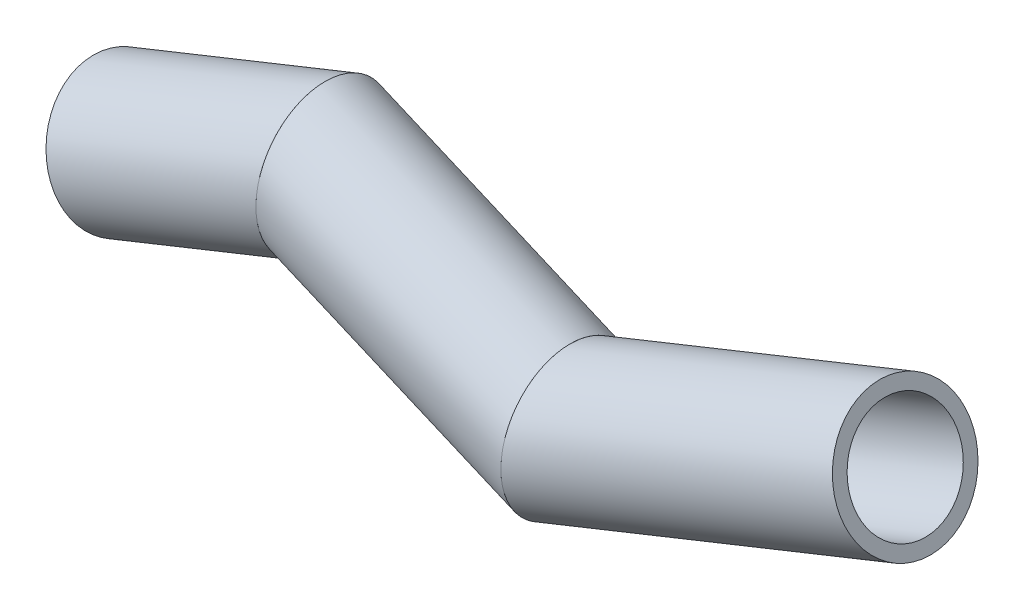
ISO-10303-21;
HEADER;
FILE_DESCRIPTION(('STEP AP214'),'2;1');
FILE_NAME('part.step','',(''),(''),'','','');
FILE_SCHEMA(('AUTOMOTIVE_DESIGN { 1 0 10303 214 1 1 1 1 }'));
ENDSEC;
DATA;
#1=APPLICATION_CONTEXT('core data for automotive mechanical design processes');
#2=APPLICATION_PROTOCOL_DEFINITION('international standard','automotive_design',2000,#1);
#3=PRODUCT_CONTEXT('',#1,'mechanical');
#4=PRODUCT('Part','Part','',(#3));
#5=PRODUCT_RELATED_PRODUCT_CATEGORY('part','',(#4));
#6=PRODUCT_DEFINITION_FORMATION('','',#4);
#7=PRODUCT_DEFINITION_CONTEXT('part definition',#1,'design');
#8=PRODUCT_DEFINITION('design','',#6,#7);
#9=PRODUCT_DEFINITION_SHAPE('','',#8);
#10=(LENGTH_UNIT() NAMED_UNIT(*) SI_UNIT(.MILLI.,.METRE.));
#11=(NAMED_UNIT(*) PLANE_ANGLE_UNIT() SI_UNIT($,.RADIAN.));
#12=(NAMED_UNIT(*) SI_UNIT($,.STERADIAN.) SOLID_ANGLE_UNIT());
#13=UNCERTAINTY_MEASURE_WITH_UNIT(LENGTH_MEASURE(1.E-05),#10,'distance_accuracy_value','');
#14=(GEOMETRIC_REPRESENTATION_CONTEXT(3) GLOBAL_UNCERTAINTY_ASSIGNED_CONTEXT((#13)) GLOBAL_UNIT_ASSIGNED_CONTEXT((#10,
#11,#12)) REPRESENTATION_CONTEXT('',''));
#15=CARTESIAN_POINT('',(0.,0.,0.));
#16=DIRECTION('',(0.,0.,1.));
#17=DIRECTION('',(1.,0.,0.));
#18=AXIS2_PLACEMENT_3D('',#15,#16,#17);
#19=CARTESIAN_POINT('',(-21.6728269526403,6.23333518549388,0.));
#20=DIRECTION('',(-0.928232154032729,-0.372001435776475,0.));
#21=DIRECTION('',(0.372001435776475,-0.92823215403273,0.));
#22=AXIS2_PLACEMENT_3D('',#19,#20,#21);
#23=CYLINDRICAL_SURFACE('',#22,13.3223);
#24=CARTESIAN_POINT('',(-71.9230982941602,-13.905132336871,0.));
#25=DIRECTION('',(0.92823215403273,0.372001435776475,0.));
#26=DIRECTION('',(-0.372001435776475,0.92823215403273,0.));
#27=AXIS2_PLACEMENT_3D('',#24,#25,#26);
#28=CIRCLE('',#27,13.3223);
#29=CARTESIAN_POINT('',(-76.8790130220051,-1.53894511120073,0.));
#30=VERTEX_POINT('',#29);
#31=EDGE_CURVE('E67',#30,#30,#28,.T.);
#32=ORIENTED_EDGE('',*,*,#31,.F.);
#33=EDGE_LOOP('',(#32));
#34=FACE_BOUND('',#33,.T.);
#35=CARTESIAN_POINT('',(-21.6728269526402,6.23333518549388,0.));
#36=DIRECTION('',(0.999933474817386,-0.011534554158182,0.));
#37=DIRECTION('',(-0.011534554158182,-0.999933474817386,0.));
#38=AXIS2_PLACEMENT_3D('',#35,#36,#37);
#39=ELLIPSE('',#38,14.4199536099553,13.3223);
#40=CARTESIAN_POINT('',(-21.8391546885128,-8.18565913441426,0.));
#41=VERTEX_POINT('',#40);
#42=EDGE_CURVE('E63',#41,#41,#39,.T.);
#43=ORIENTED_EDGE('',*,*,#42,.T.);
#44=EDGE_LOOP('',(#43));
#45=FACE_BOUND('',#44,.T.);
#46=ADVANCED_FACE('F59',(#34,#45),#23,.F.);
#47=CARTESIAN_POINT('',(-21.6728269526403,6.23333518549388,0.));
#48=DIRECTION('',(-0.928232154032729,-0.372001435776475,0.));
#49=DIRECTION('',(0.372001435776475,-0.92823215403273,0.));
#50=AXIS2_PLACEMENT_3D('',#47,#48,#49);
#51=CYLINDRICAL_SURFACE('',#50,16.7005);
#52=CARTESIAN_POINT('',(-71.9230982941602,-13.905132336871,0.));
#53=DIRECTION('',(0.92823215403273,0.372001435776475,0.));
#54=DIRECTION('',(-0.372001435776475,0.92823215403273,0.));
#55=AXIS2_PLACEMENT_3D('',#52,#53,#54);
#56=CIRCLE('',#55,16.7005);
#57=CARTESIAN_POINT('',(-78.1357082723452,1.59680875155264,0.));
#58=VERTEX_POINT('',#57);
#59=EDGE_CURVE('E71',#58,#58,#56,.T.);
#60=ORIENTED_EDGE('',*,*,#59,.T.);
#61=EDGE_LOOP('',(#60));
#62=FACE_BOUND('',#61,.T.);
#63=CARTESIAN_POINT('',(-21.6728269526402,6.23333518549388,0.));
#64=DIRECTION('',(0.999933474817386,-0.011534554158182,0.));
#65=DIRECTION('',(-0.011534554158182,-0.999933474817386,0.));
#66=AXIS2_PLACEMENT_3D('',#63,#64,#65);
#67=ELLIPSE('',#66,18.0764909409831,16.7005);
#68=CARTESIAN_POINT('',(-21.8813312163889,-11.8419532136283,0.));
#69=VERTEX_POINT('',#68);
#70=EDGE_CURVE('E12',#69,#69,#67,.T.);
#71=ORIENTED_EDGE('',*,*,#70,.F.);
#72=EDGE_LOOP('',(#71));
#73=FACE_BOUND('',#72,.T.);
#74=ADVANCED_FACE('F86',(#62,#73),#51,.T.);
#75=CARTESIAN_POINT('',(-71.9230982941602,-13.905132336871,0.));
#76=DIRECTION('',(0.92823215403273,0.372001435776475,0.));
#77=DIRECTION('',(-0.372001435776475,0.92823215403273,0.));
#78=AXIS2_PLACEMENT_3D('',#75,#76,#77);
#79=PLANE('',#78);
#80=ORIENTED_EDGE('',*,*,#31,.T.);
#81=EDGE_LOOP('',(#80));
#82=FACE_BOUND('',#81,.T.);
#83=ORIENTED_EDGE('',*,*,#59,.F.);
#84=EDGE_LOOP('',(#83));
#85=FACE_BOUND('',#84,.T.);
#86=ADVANCED_FACE('F82',(#82,#85),#79,.F.);
#87=CARTESIAN_POINT('',(-21.6728269526402,6.23333518549388,0.));
#88=DIRECTION('',(0.999933474817386,-0.011534554158182,0.));
#89=DIRECTION('',(0.011534554158182,0.999933474817386,0.));
#90=AXIS2_PLACEMENT_3D('',#87,#88,#89);
#91=PLANE('',#90);
#92=ORIENTED_EDGE('',*,*,#42,.F.);
#93=EDGE_LOOP('',(#92));
#94=FACE_BOUND('',#93,.T.);
#95=ORIENTED_EDGE('',*,*,#70,.T.);
#96=EDGE_LOOP('',(#95));
#97=FACE_BOUND('',#96,.T.);
#98=ADVANCED_FACE('F61',(#94,#97),#91,.T.);
#99=CLOSED_SHELL('',(#46,#74,#86,#98));
#100=MANIFOLD_SOLID_BREP('B2',#99);
#101=CARTESIAN_POINT('',(38.2732089903887,-19.4111543051198,0.));
#102=DIRECTION('',(-0.919403988480621,0.39331451278325,0.));
#103=DIRECTION('',(-0.39331451278325,-0.919403988480622,0.));
#104=AXIS2_PLACEMENT_3D('',#101,#102,#103);
#105=CYLINDRICAL_SURFACE('',#104,13.3223);
#106=CARTESIAN_POINT('',(38.2732089903887,-19.4111543051198,0.));
#107=DIRECTION('',(0.999933474817386,-0.0115345541581818,0.));
#108=DIRECTION('',(0.0115345541581818,0.999933474817386,0.));
#109=AXIS2_PLACEMENT_3D('',#106,#107,#108);
#110=ELLIPSE('',#109,14.4199536099553,13.3223);
#111=CARTESIAN_POINT('',(38.4395367262612,-4.99215998521165,0.));
#112=VERTEX_POINT('',#111);
#113=EDGE_CURVE('E171',#112,#112,#110,.T.);
#114=ORIENTED_EDGE('',*,*,#113,.T.);
#115=EDGE_LOOP('',(#114));
#116=FACE_BOUND('',#115,.T.);
#117=CARTESIAN_POINT('',(-21.6728269526402,6.23333518549389,0.));
#118=DIRECTION('',(-0.999933474817386,0.0115345541581818,0.));
#119=DIRECTION('',(0.0115345541581818,0.999933474817386,0.));
#120=AXIS2_PLACEMENT_3D('',#117,#118,#119);
#121=ELLIPSE('',#120,14.4199536099553,13.3223);
#122=CARTESIAN_POINT('',(-21.5064992167678,20.652329505402,0.));
#123=VERTEX_POINT('',#122);
#124=EDGE_CURVE('E161',#123,#123,#121,.T.);
#125=ORIENTED_EDGE('',*,*,#124,.T.);
#126=EDGE_LOOP('',(#125));
#127=FACE_BOUND('',#126,.T.);
#128=ADVANCED_FACE('F157',(#116,#127),#105,.F.);
#129=CARTESIAN_POINT('',(38.2732089903887,-19.4111543051198,0.));
#130=DIRECTION('',(-0.919403988480621,0.39331451278325,0.));
#131=DIRECTION('',(-0.39331451278325,-0.919403988480622,0.));
#132=AXIS2_PLACEMENT_3D('',#129,#130,#131);
#133=CYLINDRICAL_SURFACE('',#132,16.7005);
#134=CARTESIAN_POINT('',(38.2732089903887,-19.4111543051198,0.));
#135=DIRECTION('',(0.999933474817386,-0.0115345541581818,0.));
#136=DIRECTION('',(0.0115345541581818,0.999933474817386,0.));
#137=AXIS2_PLACEMENT_3D('',#134,#135,#136);
#138=ELLIPSE('',#137,18.0764909409831,16.7005);
#139=CARTESIAN_POINT('',(38.4817132541373,-1.33586590599757,0.));
#140=VERTEX_POINT('',#139);
#141=EDGE_CURVE('E165',#140,#140,#138,.T.);
#142=ORIENTED_EDGE('',*,*,#141,.F.);
#143=EDGE_LOOP('',(#142));
#144=FACE_BOUND('',#143,.T.);
#145=CARTESIAN_POINT('',(-21.6728269526402,6.23333518549389,0.));
#146=DIRECTION('',(-0.999933474817386,0.0115345541581818,0.));
#147=DIRECTION('',(0.0115345541581818,0.999933474817386,0.));
#148=AXIS2_PLACEMENT_3D('',#145,#146,#147);
#149=ELLIPSE('',#148,18.0764909409831,16.7005);
#150=CARTESIAN_POINT('',(-21.4643226888916,24.3086235846161,0.));
#151=VERTEX_POINT('',#150);
#152=EDGE_CURVE('E58',#151,#151,#149,.T.);
#153=ORIENTED_EDGE('',*,*,#152,.F.);
#154=EDGE_LOOP('',(#153));
#155=FACE_BOUND('',#154,.T.);
#156=ADVANCED_FACE('F184',(#144,#155),#133,.T.);
#157=CARTESIAN_POINT('',(38.2732089903887,-19.4111543051198,0.));
#158=DIRECTION('',(0.999933474817386,-0.0115345541581818,0.));
#159=DIRECTION('',(0.0115345541581818,0.999933474817386,0.));
#160=AXIS2_PLACEMENT_3D('',#157,#158,#159);
#161=PLANE('',#160);
#162=ORIENTED_EDGE('',*,*,#113,.F.);
#163=EDGE_LOOP('',(#162));
#164=FACE_BOUND('',#163,.T.);
#165=ORIENTED_EDGE('',*,*,#141,.T.);
#166=EDGE_LOOP('',(#165));
#167=FACE_BOUND('',#166,.T.);
#168=ADVANCED_FACE('F180',(#164,#167),#161,.T.);
#169=CARTESIAN_POINT('',(-21.6728269526402,6.23333518549388,0.));
#170=DIRECTION('',(-0.999933474817386,0.0115345541581818,0.));
#171=DIRECTION('',(-0.0115345541581818,-0.999933474817386,0.));
#172=AXIS2_PLACEMENT_3D('',#169,#170,#171);
#173=PLANE('',#172);
#174=ORIENTED_EDGE('',*,*,#124,.F.);
#175=EDGE_LOOP('',(#174));
#176=FACE_BOUND('',#175,.T.);
#177=ORIENTED_EDGE('',*,*,#152,.T.);
#178=EDGE_LOOP('',(#177));
#179=FACE_BOUND('',#178,.T.);
#180=ADVANCED_FACE('F159',(#176,#179),#173,.T.);
#181=CLOSED_SHELL('',(#128,#156,#168,#180));
#182=MANIFOLD_SOLID_BREP('B7',#181);
#183=CARTESIAN_POINT('',(120.512938424309,13.5475158878637,0.));
#184=DIRECTION('',(-0.92823215403273,-0.372001435776475,0.));
#185=DIRECTION('',(0.372001435776475,-0.92823215403273,0.));
#186=AXIS2_PLACEMENT_3D('',#183,#184,#185);
#187=CYLINDRICAL_SURFACE('',#186,13.3223);
#188=CARTESIAN_POINT('',(120.512938424309,13.5475158878637,0.));
#189=DIRECTION('',(0.92823215403273,0.372001435776475,0.));
#190=DIRECTION('',(-0.372001435776475,0.92823215403273,0.));
#191=AXIS2_PLACEMENT_3D('',#188,#189,#190);
#192=CIRCLE('',#191,13.3223);
#193=CARTESIAN_POINT('',(115.557023696465,25.9137031135339,0.));
#194=VERTEX_POINT('',#193);
#195=EDGE_CURVE('E266',#194,#194,#192,.T.);
#196=ORIENTED_EDGE('',*,*,#195,.T.);
#197=EDGE_LOOP('',(#196));
#198=FACE_BOUND('',#197,.T.);
#199=CARTESIAN_POINT('',(38.2732089903886,-19.4111543051198,0.));
#200=DIRECTION('',(-0.999933474817386,0.011534554158182,0.));
#201=DIRECTION('',(-0.011534554158182,-0.999933474817386,0.));
#202=AXIS2_PLACEMENT_3D('',#199,#200,#201);
#203=ELLIPSE('',#202,14.4199536099553,13.3223);
#204=CARTESIAN_POINT('',(38.1068812545161,-33.8301486250279,0.));
#205=VERTEX_POINT('',#204);
#206=EDGE_CURVE('E254',#205,#205,#203,.T.);
#207=ORIENTED_EDGE('',*,*,#206,.T.);
#208=EDGE_LOOP('',(#207));
#209=FACE_BOUND('',#208,.T.);
#210=ADVANCED_FACE('F250',(#198,#209),#187,.F.);
#211=CARTESIAN_POINT('',(120.512938424309,13.5475158878637,0.));
#212=DIRECTION('',(-0.92823215403273,-0.372001435776475,0.));
#213=DIRECTION('',(0.372001435776475,-0.92823215403273,0.));
#214=AXIS2_PLACEMENT_3D('',#211,#212,#213);
#215=CYLINDRICAL_SURFACE('',#214,16.7005);
#216=CARTESIAN_POINT('',(120.512938424309,13.5475158878637,0.));
#217=DIRECTION('',(0.92823215403273,0.372001435776475,0.));
#218=DIRECTION('',(-0.372001435776475,0.92823215403273,0.));
#219=AXIS2_PLACEMENT_3D('',#216,#217,#218);
#220=CIRCLE('',#219,16.7005);
#221=CARTESIAN_POINT('',(114.300328446124,29.0494569762873,0.));
#222=VERTEX_POINT('',#221);
#223=EDGE_CURVE('E259',#222,#222,#220,.T.);
#224=ORIENTED_EDGE('',*,*,#223,.F.);
#225=EDGE_LOOP('',(#224));
#226=FACE_BOUND('',#225,.T.);
#227=CARTESIAN_POINT('',(38.2732089903886,-19.4111543051198,0.));
#228=DIRECTION('',(-0.999933474817386,0.011534554158182,0.));
#229=DIRECTION('',(-0.011534554158182,-0.999933474817386,0.));
#230=AXIS2_PLACEMENT_3D('',#227,#228,#229);
#231=ELLIPSE('',#230,18.0764909409831,16.7005);
#232=CARTESIAN_POINT('',(38.06470472664,-37.486442704242,0.));
#233=VERTEX_POINT('',#232);
#234=EDGE_CURVE('E156',#233,#233,#231,.T.);
#235=ORIENTED_EDGE('',*,*,#234,.F.);
#236=EDGE_LOOP('',(#235));
#237=FACE_BOUND('',#236,.T.);
#238=ADVANCED_FACE('F281',(#226,#237),#215,.T.);
#239=CARTESIAN_POINT('',(120.512938424309,13.5475158878637,0.));
#240=DIRECTION('',(0.92823215403273,0.372001435776475,0.));
#241=DIRECTION('',(-0.372001435776475,0.92823215403273,0.));
#242=AXIS2_PLACEMENT_3D('',#239,#240,#241);
#243=PLANE('',#242);
#244=ORIENTED_EDGE('',*,*,#195,.F.);
#245=EDGE_LOOP('',(#244));
#246=FACE_BOUND('',#245,.T.);
#247=ORIENTED_EDGE('',*,*,#223,.T.);
#248=EDGE_LOOP('',(#247));
#249=FACE_BOUND('',#248,.T.);
#250=ADVANCED_FACE('F277',(#246,#249),#243,.T.);
#251=CARTESIAN_POINT('',(38.2732089903887,-19.4111543051198,0.));
#252=DIRECTION('',(-0.999933474817386,0.011534554158182,0.));
#253=DIRECTION('',(-0.011534554158182,-0.999933474817386,0.));
#254=AXIS2_PLACEMENT_3D('',#251,#252,#253);
#255=PLANE('',#254);
#256=ORIENTED_EDGE('',*,*,#206,.F.);
#257=EDGE_LOOP('',(#256));
#258=FACE_BOUND('',#257,.T.);
#259=ORIENTED_EDGE('',*,*,#234,.T.);
#260=EDGE_LOOP('',(#259));
#261=FACE_BOUND('',#260,.T.);
#262=ADVANCED_FACE('F252',(#258,#261),#255,.T.);
#263=CLOSED_SHELL('',(#210,#238,#250,#262));
#264=MANIFOLD_SOLID_BREP('B53',#263);
#265=ADVANCED_BREP_SHAPE_REPRESENTATION('',(#18,#100,#182,#264),#14);
#266=SHAPE_DEFINITION_REPRESENTATION(#9,#265);
ENDSEC;
END-ISO-10303-21;
